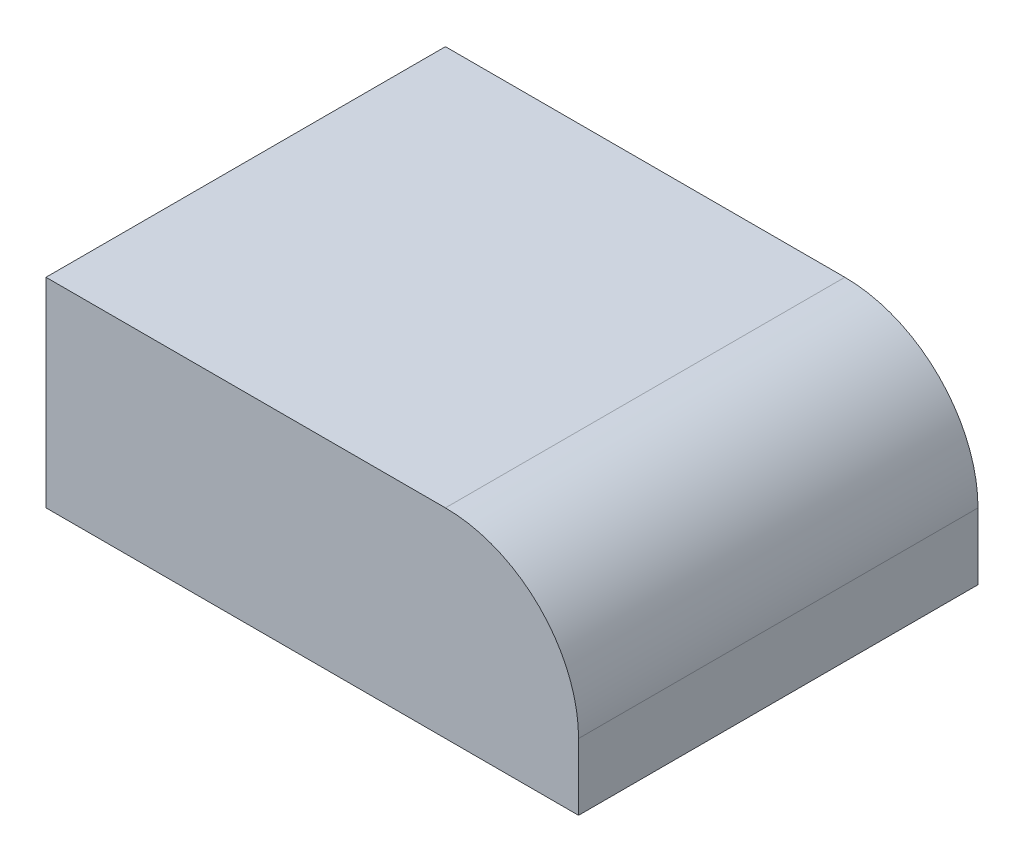
ISO-10303-21;
HEADER;
FILE_DESCRIPTION(('STEP AP214'),'2;1');
FILE_NAME('part.step','',(''),(''),'','','');
FILE_SCHEMA(('AUTOMOTIVE_DESIGN { 1 0 10303 214 1 1 1 1 }'));
ENDSEC;
DATA;
#1=APPLICATION_CONTEXT('core data for automotive mechanical design processes');
#2=APPLICATION_PROTOCOL_DEFINITION('international standard','automotive_design',2000,#1);
#3=PRODUCT_CONTEXT('',#1,'mechanical');
#4=PRODUCT('Part','Part','',(#3));
#5=PRODUCT_RELATED_PRODUCT_CATEGORY('part','',(#4));
#6=PRODUCT_DEFINITION_FORMATION('','',#4);
#7=PRODUCT_DEFINITION_CONTEXT('part definition',#1,'design');
#8=PRODUCT_DEFINITION('design','',#6,#7);
#9=PRODUCT_DEFINITION_SHAPE('','',#8);
#10=(LENGTH_UNIT() NAMED_UNIT(*) SI_UNIT(.MILLI.,.METRE.));
#11=(NAMED_UNIT(*) PLANE_ANGLE_UNIT() SI_UNIT($,.RADIAN.));
#12=(NAMED_UNIT(*) SI_UNIT($,.STERADIAN.) SOLID_ANGLE_UNIT());
#13=UNCERTAINTY_MEASURE_WITH_UNIT(LENGTH_MEASURE(1.E-05),#10,'distance_accuracy_value','');
#14=(GEOMETRIC_REPRESENTATION_CONTEXT(3) GLOBAL_UNCERTAINTY_ASSIGNED_CONTEXT((#13)) GLOBAL_UNIT_ASSIGNED_CONTEXT((#10,
#11,#12)) REPRESENTATION_CONTEXT('',''));
#15=CARTESIAN_POINT('',(0.,0.,0.));
#16=DIRECTION('',(0.,0.,1.));
#17=DIRECTION('',(1.,0.,0.));
#18=AXIS2_PLACEMENT_3D('',#15,#16,#17);
#19=CARTESIAN_POINT('',(0.,0.,38.1));
#20=DIRECTION('',(1.,0.,0.));
#21=DIRECTION('',(0.,0.,-1.));
#22=AXIS2_PLACEMENT_3D('',#19,#20,#21);
#23=PLANE('',#22);
#24=DIRECTION('',(0.,-1.,0.));
#25=VECTOR('',#24,1.);
#26=CARTESIAN_POINT('',(0.,0.,0.));
#27=LINE('',#26,#25);
#28=CARTESIAN_POINT('',(0.,19.05,0.));
#29=VERTEX_POINT('',#28);
#30=CARTESIAN_POINT('',(0.,0.,0.));
#31=VERTEX_POINT('',#30);
#32=EDGE_CURVE('E102',#29,#31,#27,.T.);
#33=ORIENTED_EDGE('',*,*,#32,.T.);
#34=DIRECTION('',(0.,0.,-1.));
#35=VECTOR('',#34,1.);
#36=CARTESIAN_POINT('',(0.,0.,38.1));
#37=LINE('',#36,#35);
#38=CARTESIAN_POINT('',(0.,0.,38.1));
#39=VERTEX_POINT('',#38);
#40=EDGE_CURVE('E84',#39,#31,#37,.T.);
#41=ORIENTED_EDGE('',*,*,#40,.F.);
#42=DIRECTION('',(0.,-1.,0.));
#43=VECTOR('',#42,1.);
#44=CARTESIAN_POINT('',(0.,0.,38.1));
#45=LINE('',#44,#43);
#46=CARTESIAN_POINT('',(0.,19.05,38.1));
#47=VERTEX_POINT('',#46);
#48=EDGE_CURVE('E90',#47,#39,#45,.T.);
#49=ORIENTED_EDGE('',*,*,#48,.F.);
#50=DIRECTION('',(0.,0.,-1.));
#51=VECTOR('',#50,1.);
#52=CARTESIAN_POINT('',(0.,19.05,38.1));
#53=LINE('',#52,#51);
#54=EDGE_CURVE('E107',#47,#29,#53,.T.);
#55=ORIENTED_EDGE('',*,*,#54,.T.);
#56=EDGE_LOOP('',(#33,#41,#49,#55));
#57=FACE_BOUND('',#56,.T.);
#58=ADVANCED_FACE('F33',(#57),#23,.F.);
#59=CARTESIAN_POINT('',(0.,0.,38.1));
#60=DIRECTION('',(0.,1.,0.));
#61=DIRECTION('',(0.,0.,1.));
#62=AXIS2_PLACEMENT_3D('',#59,#60,#61);
#63=PLANE('',#62);
#64=DIRECTION('',(1.,0.,0.));
#65=VECTOR('',#64,1.);
#66=CARTESIAN_POINT('',(0.,0.,0.));
#67=LINE('',#66,#65);
#68=CARTESIAN_POINT('',(50.8,0.,0.));
#69=VERTEX_POINT('',#68);
#70=EDGE_CURVE('E115',#31,#69,#67,.T.);
#71=ORIENTED_EDGE('',*,*,#70,.T.);
#72=DIRECTION('',(0.,0.,-1.));
#73=VECTOR('',#72,1.);
#74=CARTESIAN_POINT('',(50.8,0.,38.1));
#75=LINE('',#74,#73);
#76=CARTESIAN_POINT('',(50.8,0.,38.1));
#77=VERTEX_POINT('',#76);
#78=EDGE_CURVE('E87',#77,#69,#75,.T.);
#79=ORIENTED_EDGE('',*,*,#78,.F.);
#80=DIRECTION('',(1.,0.,0.));
#81=VECTOR('',#80,1.);
#82=CARTESIAN_POINT('',(0.,0.,38.1));
#83=LINE('',#82,#81);
#84=EDGE_CURVE('E80',#39,#77,#83,.T.);
#85=ORIENTED_EDGE('',*,*,#84,.F.);
#86=ORIENTED_EDGE('',*,*,#40,.T.);
#87=EDGE_LOOP('',(#71,#79,#85,#86));
#88=FACE_BOUND('',#87,.T.);
#89=ADVANCED_FACE('F82',(#88),#63,.F.);
#90=CARTESIAN_POINT('',(50.8,0.,38.1));
#91=DIRECTION('',(-1.,0.,0.));
#92=DIRECTION('',(0.,0.,1.));
#93=AXIS2_PLACEMENT_3D('',#90,#91,#92);
#94=PLANE('',#93);
#95=DIRECTION('',(0.,1.,0.));
#96=VECTOR('',#95,1.);
#97=CARTESIAN_POINT('',(50.8,0.,0.));
#98=LINE('',#97,#96);
#99=CARTESIAN_POINT('',(50.8,6.35,0.));
#100=VERTEX_POINT('',#99);
#101=EDGE_CURVE('E113',#69,#100,#98,.T.);
#102=ORIENTED_EDGE('',*,*,#101,.T.);
#103=DIRECTION('',(0.,0.,-1.));
#104=VECTOR('',#103,1.);
#105=CARTESIAN_POINT('',(50.8,6.35,38.1));
#106=LINE('',#105,#104);
#107=CARTESIAN_POINT('',(50.8,6.35,38.1));
#108=VERTEX_POINT('',#107);
#109=EDGE_CURVE('E41',#100,#108,#106,.F.);
#110=ORIENTED_EDGE('',*,*,#109,.T.);
#111=DIRECTION('',(0.,1.,0.));
#112=VECTOR('',#111,1.);
#113=CARTESIAN_POINT('',(50.8,0.,38.1));
#114=LINE('',#113,#112);
#115=EDGE_CURVE('E89',#77,#108,#114,.T.);
#116=ORIENTED_EDGE('',*,*,#115,.F.);
#117=ORIENTED_EDGE('',*,*,#78,.T.);
#118=EDGE_LOOP('',(#102,#110,#116,#117));
#119=FACE_BOUND('',#118,.T.);
#120=ADVANCED_FACE('F125',(#119),#94,.F.);
#121=CARTESIAN_POINT('',(0.,19.05,38.1));
#122=DIRECTION('',(0.,-1.,0.));
#123=DIRECTION('',(0.,0.,-1.));
#124=AXIS2_PLACEMENT_3D('',#121,#122,#123);
#125=PLANE('',#124);
#126=DIRECTION('',(-1.,0.,0.));
#127=VECTOR('',#126,1.);
#128=CARTESIAN_POINT('',(0.,19.05,38.1));
#129=LINE('',#128,#127);
#130=CARTESIAN_POINT('',(38.1,19.05,38.1));
#131=VERTEX_POINT('',#130);
#132=EDGE_CURVE('E95',#131,#47,#129,.T.);
#133=ORIENTED_EDGE('',*,*,#132,.F.);
#134=DIRECTION('',(0.,0.,-1.));
#135=VECTOR('',#134,1.);
#136=CARTESIAN_POINT('',(38.1,19.05,38.1));
#137=LINE('',#136,#135);
#138=CARTESIAN_POINT('',(38.1,19.05,0.));
#139=VERTEX_POINT('',#138);
#140=EDGE_CURVE('E103',#131,#139,#137,.T.);
#141=ORIENTED_EDGE('',*,*,#140,.T.);
#142=DIRECTION('',(-1.,0.,0.));
#143=VECTOR('',#142,1.);
#144=CARTESIAN_POINT('',(0.,19.05,0.));
#145=LINE('',#144,#143);
#146=EDGE_CURVE('E99',#139,#29,#145,.T.);
#147=ORIENTED_EDGE('',*,*,#146,.T.);
#148=ORIENTED_EDGE('',*,*,#54,.F.);
#149=EDGE_LOOP('',(#133,#141,#147,#148));
#150=FACE_BOUND('',#149,.T.);
#151=ADVANCED_FACE('F123',(#150),#125,.F.);
#152=CARTESIAN_POINT('',(0.,0.,38.1));
#153=DIRECTION('',(0.,0.,-1.));
#154=DIRECTION('',(-1.,0.,0.));
#155=AXIS2_PLACEMENT_3D('',#152,#153,#154);
#156=PLANE('',#155);
#157=ORIENTED_EDGE('',*,*,#115,.T.);
#158=CARTESIAN_POINT('',(38.1,6.35,38.1));
#159=DIRECTION('',(0.,0.,-1.));
#160=DIRECTION('',(-1.,0.,0.));
#161=AXIS2_PLACEMENT_3D('',#158,#159,#160);
#162=CIRCLE('',#161,12.7);
#163=EDGE_CURVE('E11',#108,#131,#162,.F.);
#164=ORIENTED_EDGE('',*,*,#163,.T.);
#165=ORIENTED_EDGE('',*,*,#132,.T.);
#166=ORIENTED_EDGE('',*,*,#48,.T.);
#167=ORIENTED_EDGE('',*,*,#84,.T.);
#168=EDGE_LOOP('',(#157,#164,#165,#166,#167));
#169=FACE_BOUND('',#168,.T.);
#170=ADVANCED_FACE('F93',(#169),#156,.F.);
#171=CARTESIAN_POINT('',(0.,0.,0.));
#172=DIRECTION('',(0.,0.,-1.));
#173=DIRECTION('',(-1.,0.,0.));
#174=AXIS2_PLACEMENT_3D('',#171,#172,#173);
#175=PLANE('',#174);
#176=ORIENTED_EDGE('',*,*,#146,.F.);
#177=CARTESIAN_POINT('',(38.1,6.35,0.));
#178=DIRECTION('',(0.,0.,-1.));
#179=DIRECTION('',(-1.,0.,0.));
#180=AXIS2_PLACEMENT_3D('',#177,#178,#179);
#181=CIRCLE('',#180,12.7);
#182=EDGE_CURVE('E55',#139,#100,#181,.T.);
#183=ORIENTED_EDGE('',*,*,#182,.T.);
#184=ORIENTED_EDGE('',*,*,#101,.F.);
#185=ORIENTED_EDGE('',*,*,#70,.F.);
#186=ORIENTED_EDGE('',*,*,#32,.F.);
#187=EDGE_LOOP('',(#176,#183,#184,#185,#186));
#188=FACE_BOUND('',#187,.T.);
#189=ADVANCED_FACE('F124',(#188),#175,.T.);
#190=CARTESIAN_POINT('',(38.1,6.35,38.1));
#191=DIRECTION('',(0.,0.,-1.));
#192=DIRECTION('',(-1.,0.,0.));
#193=AXIS2_PLACEMENT_3D('',#190,#191,#192);
#194=CYLINDRICAL_SURFACE('',#193,12.7);
#195=ORIENTED_EDGE('',*,*,#163,.F.);
#196=ORIENTED_EDGE('',*,*,#109,.F.);
#197=ORIENTED_EDGE('',*,*,#182,.F.);
#198=ORIENTED_EDGE('',*,*,#140,.F.);
#199=EDGE_LOOP('',(#195,#196,#197,#198));
#200=FACE_BOUND('',#199,.T.);
#201=ADVANCED_FACE('F35',(#200),#194,.T.);
#202=CLOSED_SHELL('',(#58,#89,#120,#151,#170,#189,#201));
#203=MANIFOLD_SOLID_BREP('B2',#202);
#204=ADVANCED_BREP_SHAPE_REPRESENTATION('',(#18,#203),#14);
#205=SHAPE_DEFINITION_REPRESENTATION(#9,#204);
ENDSEC;
END-ISO-10303-21;
